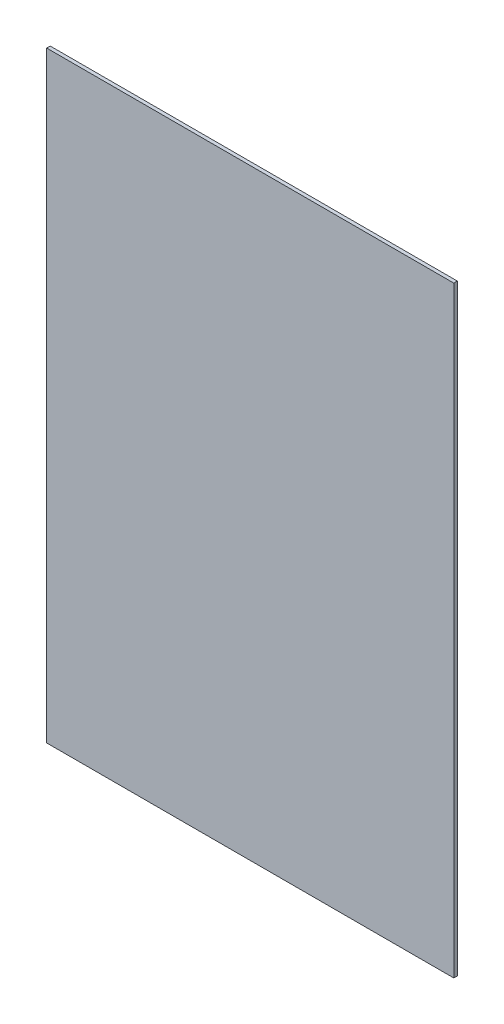
ISO-10303-21;
HEADER;
FILE_DESCRIPTION(('STEP AP214'),'2;1');
FILE_NAME('part.step','',(''),(''),'','','');
FILE_SCHEMA(('AUTOMOTIVE_DESIGN { 1 0 10303 214 1 1 1 1 }'));
ENDSEC;
DATA;
#1=APPLICATION_CONTEXT('core data for automotive mechanical design processes');
#2=APPLICATION_PROTOCOL_DEFINITION('international standard','automotive_design',2000,#1);
#3=PRODUCT_CONTEXT('',#1,'mechanical');
#4=PRODUCT('Part','Part','',(#3));
#5=PRODUCT_RELATED_PRODUCT_CATEGORY('part','',(#4));
#6=PRODUCT_DEFINITION_FORMATION('','',#4);
#7=PRODUCT_DEFINITION_CONTEXT('part definition',#1,'design');
#8=PRODUCT_DEFINITION('design','',#6,#7);
#9=PRODUCT_DEFINITION_SHAPE('','',#8);
#10=(LENGTH_UNIT() NAMED_UNIT(*) SI_UNIT(.MILLI.,.METRE.));
#11=(NAMED_UNIT(*) PLANE_ANGLE_UNIT() SI_UNIT($,.RADIAN.));
#12=(NAMED_UNIT(*) SI_UNIT($,.STERADIAN.) SOLID_ANGLE_UNIT());
#13=UNCERTAINTY_MEASURE_WITH_UNIT(LENGTH_MEASURE(1.E-05),#10,'distance_accuracy_value','');
#14=(GEOMETRIC_REPRESENTATION_CONTEXT(3) GLOBAL_UNCERTAINTY_ASSIGNED_CONTEXT((#13)) GLOBAL_UNIT_ASSIGNED_CONTEXT((#10,
#11,#12)) REPRESENTATION_CONTEXT('',''));
#15=CARTESIAN_POINT('',(0.,0.,0.));
#16=DIRECTION('',(0.,0.,1.));
#17=DIRECTION('',(1.,0.,0.));
#18=AXIS2_PLACEMENT_3D('',#15,#16,#17);
#19=CARTESIAN_POINT('',(115.,170.,2.));
#20=DIRECTION('',(-1.,0.,0.));
#21=DIRECTION('',(0.,-1.,0.));
#22=AXIS2_PLACEMENT_3D('',#19,#20,#21);
#23=PLANE('',#22);
#24=DIRECTION('',(0.,1.,0.));
#25=VECTOR('',#24,1.);
#26=CARTESIAN_POINT('',(115.,170.,0.));
#27=LINE('',#26,#25);
#28=CARTESIAN_POINT('',(115.,-170.,0.));
#29=VERTEX_POINT('',#28);
#30=CARTESIAN_POINT('',(115.,170.,0.));
#31=VERTEX_POINT('',#30);
#32=EDGE_CURVE('E102',#29,#31,#27,.T.);
#33=ORIENTED_EDGE('',*,*,#32,.T.);
#34=DIRECTION('',(0.,0.,-1.));
#35=VECTOR('',#34,1.);
#36=CARTESIAN_POINT('',(115.,170.,2.));
#37=LINE('',#36,#35);
#38=CARTESIAN_POINT('',(115.,170.,2.));
#39=VERTEX_POINT('',#38);
#40=EDGE_CURVE('E11',#39,#31,#37,.T.);
#41=ORIENTED_EDGE('',*,*,#40,.F.);
#42=DIRECTION('',(0.,1.,0.));
#43=VECTOR('',#42,1.);
#44=CARTESIAN_POINT('',(115.,170.,2.));
#45=LINE('',#44,#43);
#46=CARTESIAN_POINT('',(115.,-170.,2.));
#47=VERTEX_POINT('',#46);
#48=EDGE_CURVE('E90',#47,#39,#45,.T.);
#49=ORIENTED_EDGE('',*,*,#48,.F.);
#50=DIRECTION('',(0.,0.,-1.));
#51=VECTOR('',#50,1.);
#52=CARTESIAN_POINT('',(115.,-170.,2.));
#53=LINE('',#52,#51);
#54=EDGE_CURVE('E98',#47,#29,#53,.T.);
#55=ORIENTED_EDGE('',*,*,#54,.T.);
#56=EDGE_LOOP('',(#33,#41,#49,#55));
#57=FACE_BOUND('',#56,.T.);
#58=ADVANCED_FACE('F39',(#57),#23,.F.);
#59=CARTESIAN_POINT('',(-115.,170.,2.));
#60=DIRECTION('',(0.,-1.,0.));
#61=DIRECTION('',(0.,0.,-1.));
#62=AXIS2_PLACEMENT_3D('',#59,#60,#61);
#63=PLANE('',#62);
#64=DIRECTION('',(-1.,0.,0.));
#65=VECTOR('',#64,1.);
#66=CARTESIAN_POINT('',(-115.,170.,0.));
#67=LINE('',#66,#65);
#68=CARTESIAN_POINT('',(-115.,170.,0.));
#69=VERTEX_POINT('',#68);
#70=EDGE_CURVE('E94',#31,#69,#67,.T.);
#71=ORIENTED_EDGE('',*,*,#70,.T.);
#72=DIRECTION('',(0.,0.,-1.));
#73=VECTOR('',#72,1.);
#74=CARTESIAN_POINT('',(-115.,170.,2.));
#75=LINE('',#74,#73);
#76=CARTESIAN_POINT('',(-115.,170.,2.));
#77=VERTEX_POINT('',#76);
#78=EDGE_CURVE('E47',#77,#69,#75,.T.);
#79=ORIENTED_EDGE('',*,*,#78,.F.);
#80=DIRECTION('',(-1.,0.,0.));
#81=VECTOR('',#80,1.);
#82=CARTESIAN_POINT('',(-115.,170.,2.));
#83=LINE('',#82,#81);
#84=EDGE_CURVE('E85',#39,#77,#83,.T.);
#85=ORIENTED_EDGE('',*,*,#84,.F.);
#86=ORIENTED_EDGE('',*,*,#40,.T.);
#87=EDGE_LOOP('',(#71,#79,#85,#86));
#88=FACE_BOUND('',#87,.T.);
#89=ADVANCED_FACE('F93',(#88),#63,.F.);
#90=CARTESIAN_POINT('',(-115.,170.,2.));
#91=DIRECTION('',(1.,0.,0.));
#92=DIRECTION('',(0.,1.,0.));
#93=AXIS2_PLACEMENT_3D('',#90,#91,#92);
#94=PLANE('',#93);
#95=DIRECTION('',(0.,-1.,0.));
#96=VECTOR('',#95,1.);
#97=CARTESIAN_POINT('',(-115.,170.,0.));
#98=LINE('',#97,#96);
#99=CARTESIAN_POINT('',(-115.,-170.,0.));
#100=VERTEX_POINT('',#99);
#101=EDGE_CURVE('E72',#69,#100,#98,.T.);
#102=ORIENTED_EDGE('',*,*,#101,.T.);
#103=DIRECTION('',(0.,0.,-1.));
#104=VECTOR('',#103,1.);
#105=CARTESIAN_POINT('',(-115.,-170.,2.));
#106=LINE('',#105,#104);
#107=CARTESIAN_POINT('',(-115.,-170.,2.));
#108=VERTEX_POINT('',#107);
#109=EDGE_CURVE('E95',#108,#100,#106,.T.);
#110=ORIENTED_EDGE('',*,*,#109,.F.);
#111=DIRECTION('',(0.,-1.,0.));
#112=VECTOR('',#111,1.);
#113=CARTESIAN_POINT('',(-115.,170.,2.));
#114=LINE('',#113,#112);
#115=EDGE_CURVE('E88',#77,#108,#114,.T.);
#116=ORIENTED_EDGE('',*,*,#115,.F.);
#117=ORIENTED_EDGE('',*,*,#78,.T.);
#118=EDGE_LOOP('',(#102,#110,#116,#117));
#119=FACE_BOUND('',#118,.T.);
#120=ADVANCED_FACE('F96',(#119),#94,.F.);
#121=CARTESIAN_POINT('',(-115.,-170.,2.));
#122=DIRECTION('',(0.,1.,0.));
#123=DIRECTION('',(0.,0.,1.));
#124=AXIS2_PLACEMENT_3D('',#121,#122,#123);
#125=PLANE('',#124);
#126=DIRECTION('',(1.,0.,0.));
#127=VECTOR('',#126,1.);
#128=CARTESIAN_POINT('',(-115.,-170.,0.));
#129=LINE('',#128,#127);
#130=EDGE_CURVE('E78',#100,#29,#129,.T.);
#131=ORIENTED_EDGE('',*,*,#130,.T.);
#132=ORIENTED_EDGE('',*,*,#54,.F.);
#133=DIRECTION('',(1.,0.,0.));
#134=VECTOR('',#133,1.);
#135=CARTESIAN_POINT('',(-115.,-170.,2.));
#136=LINE('',#135,#134);
#137=EDGE_CURVE('E55',#108,#47,#136,.T.);
#138=ORIENTED_EDGE('',*,*,#137,.F.);
#139=ORIENTED_EDGE('',*,*,#109,.T.);
#140=EDGE_LOOP('',(#131,#132,#138,#139));
#141=FACE_BOUND('',#140,.T.);
#142=ADVANCED_FACE('F109',(#141),#125,.F.);
#143=CARTESIAN_POINT('',(0.,0.,2.));
#144=DIRECTION('',(0.,0.,1.));
#145=DIRECTION('',(1.,0.,0.));
#146=AXIS2_PLACEMENT_3D('',#143,#144,#145);
#147=PLANE('',#146);
#148=ORIENTED_EDGE('',*,*,#48,.T.);
#149=ORIENTED_EDGE('',*,*,#84,.T.);
#150=ORIENTED_EDGE('',*,*,#115,.T.);
#151=ORIENTED_EDGE('',*,*,#137,.T.);
#152=EDGE_LOOP('',(#148,#149,#150,#151));
#153=FACE_BOUND('',#152,.T.);
#154=ADVANCED_FACE('F86',(#153),#147,.T.);
#155=CARTESIAN_POINT('',(0.,0.,0.));
#156=DIRECTION('',(0.,0.,1.));
#157=DIRECTION('',(1.,0.,0.));
#158=AXIS2_PLACEMENT_3D('',#155,#156,#157);
#159=PLANE('',#158);
#160=ORIENTED_EDGE('',*,*,#32,.F.);
#161=ORIENTED_EDGE('',*,*,#130,.F.);
#162=ORIENTED_EDGE('',*,*,#101,.F.);
#163=ORIENTED_EDGE('',*,*,#70,.F.);
#164=EDGE_LOOP('',(#160,#161,#162,#163));
#165=FACE_BOUND('',#164,.T.);
#166=ADVANCED_FACE('F112',(#165),#159,.F.);
#167=CLOSED_SHELL('',(#58,#89,#120,#142,#154,#166));
#168=MANIFOLD_SOLID_BREP('B2',#167);
#169=ADVANCED_BREP_SHAPE_REPRESENTATION('',(#18,#168),#14);
#170=SHAPE_DEFINITION_REPRESENTATION(#9,#169);
ENDSEC;
END-ISO-10303-21;
